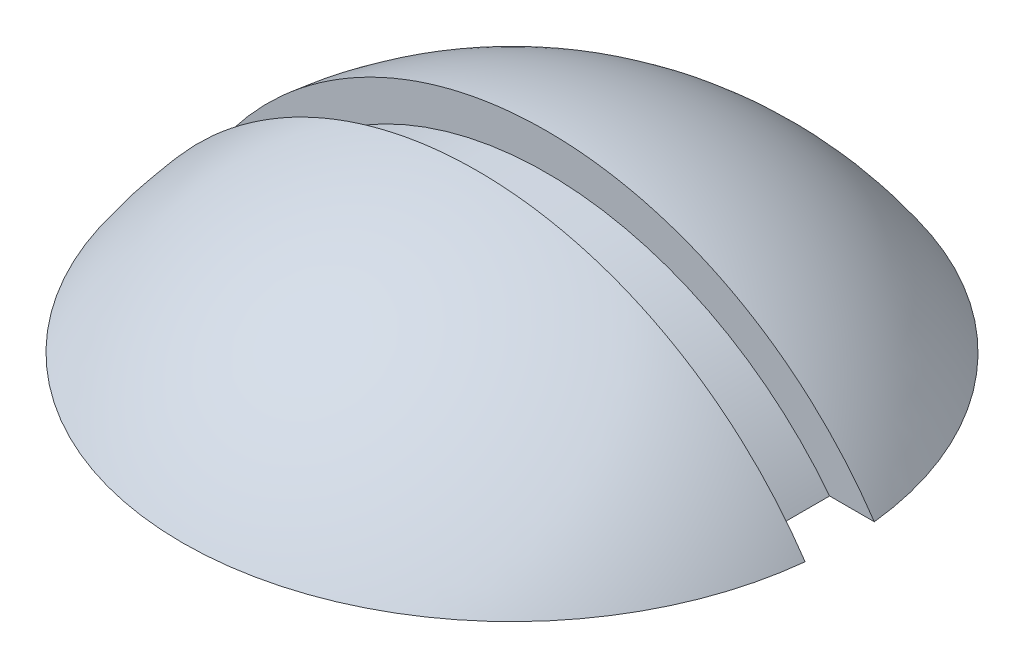
ISO-10303-21;
HEADER;
FILE_DESCRIPTION(('STEP AP214'),'2;1');
FILE_NAME('part.step','',(''),(''),'','','');
FILE_SCHEMA(('AUTOMOTIVE_DESIGN { 1 0 10303 214 1 1 1 1 }'));
ENDSEC;
DATA;
#1=APPLICATION_CONTEXT('core data for automotive mechanical design processes');
#2=APPLICATION_PROTOCOL_DEFINITION('international standard','automotive_design',2000,#1);
#3=PRODUCT_CONTEXT('',#1,'mechanical');
#4=PRODUCT('Part','Part','',(#3));
#5=PRODUCT_RELATED_PRODUCT_CATEGORY('part','',(#4));
#6=PRODUCT_DEFINITION_FORMATION('','',#4);
#7=PRODUCT_DEFINITION_CONTEXT('part definition',#1,'design');
#8=PRODUCT_DEFINITION('design','',#6,#7);
#9=PRODUCT_DEFINITION_SHAPE('','',#8);
#10=(LENGTH_UNIT() NAMED_UNIT(*) SI_UNIT(.MILLI.,.METRE.));
#11=(NAMED_UNIT(*) PLANE_ANGLE_UNIT() SI_UNIT($,.RADIAN.));
#12=(NAMED_UNIT(*) SI_UNIT($,.STERADIAN.) SOLID_ANGLE_UNIT());
#13=UNCERTAINTY_MEASURE_WITH_UNIT(LENGTH_MEASURE(1.E-05),#10,'distance_accuracy_value','');
#14=(GEOMETRIC_REPRESENTATION_CONTEXT(3) GLOBAL_UNCERTAINTY_ASSIGNED_CONTEXT((#13)) GLOBAL_UNIT_ASSIGNED_CONTEXT((#10,
#11,#12)) REPRESENTATION_CONTEXT('',''));
#15=CARTESIAN_POINT('',(0.,0.,0.));
#16=DIRECTION('',(0.,0.,1.));
#17=DIRECTION('',(1.,0.,0.));
#18=AXIS2_PLACEMENT_3D('',#15,#16,#17);
#19=CARTESIAN_POINT('',(57.1358871463461,44.4499999999999,-3.9897776749943E-13));
#20=DIRECTION('',(0.,1.,0.));
#21=DIRECTION('',(-1.,0.,0.));
#22=AXIS2_PLACEMENT_3D('',#19,#20,#21);
#23=PLANE('',#22);
#24=CARTESIAN_POINT('',(0.,44.4499999999999,0.));
#25=DIRECTION('',(0.,-1.,0.));
#26=DIRECTION('',(1.,0.,0.));
#27=AXIS2_PLACEMENT_3D('',#24,#25,#26);
#28=CIRCLE('',#27,35.56);
#29=CARTESIAN_POINT('',(35.56,44.4499999999999,0.));
#30=VERTEX_POINT('',#29);
#31=EDGE_CURVE('E127',#30,#30,#28,.T.);
#32=ORIENTED_EDGE('',*,*,#31,.F.);
#33=EDGE_LOOP('',(#32));
#34=FACE_BOUND('',#33,.T.);
#35=DIRECTION('',(0.,0.,-1.));
#36=VECTOR('',#35,1.);
#37=CARTESIAN_POINT('',(-57.1358871463462,44.45,6.9850000000004));
#38=LINE('',#37,#36);
#39=CARTESIAN_POINT('',(-57.1358871463462,44.45,6.9850000000004));
#40=VERTEX_POINT('',#39);
#41=CARTESIAN_POINT('',(-57.1358871463463,44.45,-6.9849999999996));
#42=VERTEX_POINT('',#41);
#43=EDGE_CURVE('E80',#40,#42,#38,.T.);
#44=ORIENTED_EDGE('',*,*,#43,.T.);
#45=DIRECTION('',(-1.,0.,0.));
#46=VECTOR('',#45,1.);
#47=CARTESIAN_POINT('',(-66.5266683368408,44.45,-6.98499999999954));
#48=LINE('',#47,#46);
#49=CARTESIAN_POINT('',(-66.1589553650904,44.45,-6.98499999999954));
#50=VERTEX_POINT('',#49);
#51=EDGE_CURVE('E84',#42,#50,#48,.T.);
#52=ORIENTED_EDGE('',*,*,#51,.T.);
#53=CARTESIAN_POINT('',(0.,44.4499999999999,0.));
#54=DIRECTION('',(0.,1.,0.));
#55=DIRECTION('',(1.,0.,0.));
#56=AXIS2_PLACEMENT_3D('',#53,#54,#55);
#57=CIRCLE('',#56,66.5266683368407);
#58=CARTESIAN_POINT('',(66.1589553650902,44.4499999999999,-6.98500000000046));
#59=VERTEX_POINT('',#58);
#60=EDGE_CURVE('E108',#59,#50,#57,.T.);
#61=ORIENTED_EDGE('',*,*,#60,.F.);
#62=DIRECTION('',(-1.,0.,0.));
#63=VECTOR('',#62,1.);
#64=CARTESIAN_POINT('',(66.5266683368406,44.4499999999999,-6.98500000000047));
#65=LINE('',#64,#63);
#66=CARTESIAN_POINT('',(57.1358871463462,44.4499999999999,-6.9850000000004));
#67=VERTEX_POINT('',#66);
#68=EDGE_CURVE('E99',#59,#67,#65,.T.);
#69=ORIENTED_EDGE('',*,*,#68,.T.);
#70=DIRECTION('',(0.,0.,-1.));
#71=VECTOR('',#70,1.);
#72=CARTESIAN_POINT('',(57.1358871463463,44.4499999999999,6.9849999999996));
#73=LINE('',#72,#71);
#74=CARTESIAN_POINT('',(57.1358871463463,44.4499999999999,6.9849999999996));
#75=VERTEX_POINT('',#74);
#76=EDGE_CURVE('E90',#75,#67,#73,.T.);
#77=ORIENTED_EDGE('',*,*,#76,.F.);
#78=DIRECTION('',(-1.,0.,0.));
#79=VECTOR('',#78,1.);
#80=CARTESIAN_POINT('',(66.5266683368407,44.4499999999999,6.98499999999954));
#81=LINE('',#80,#79);
#82=CARTESIAN_POINT('',(66.1589553650903,44.4499999999999,6.98499999999954));
#83=VERTEX_POINT('',#82);
#84=EDGE_CURVE('E111',#83,#75,#81,.T.);
#85=ORIENTED_EDGE('',*,*,#84,.F.);
#86=CARTESIAN_POINT('',(0.,44.4499999999999,0.));
#87=DIRECTION('',(0.,-1.,0.));
#88=DIRECTION('',(1.,0.,0.));
#89=AXIS2_PLACEMENT_3D('',#86,#87,#88);
#90=CIRCLE('',#89,66.5266683368407);
#91=CARTESIAN_POINT('',(-66.1589553650902,44.45,6.98500000000046));
#92=VERTEX_POINT('',#91);
#93=EDGE_CURVE('E50',#83,#92,#90,.T.);
#94=ORIENTED_EDGE('',*,*,#93,.T.);
#95=DIRECTION('',(-1.,0.,0.));
#96=VECTOR('',#95,1.);
#97=CARTESIAN_POINT('',(-66.5266683368406,44.45,6.98500000000047));
#98=LINE('',#97,#96);
#99=EDGE_CURVE('E57',#40,#92,#98,.T.);
#100=ORIENTED_EDGE('',*,*,#99,.F.);
#101=EDGE_LOOP('',(#44,#52,#61,#69,#77,#85,#94,#100));
#102=FACE_BOUND('',#101,.T.);
#103=ADVANCED_FACE('F41',(#34,#102),#23,.F.);
#104=CARTESIAN_POINT('',(0.,0.,0.));
#105=DIRECTION('',(0.,-1.,0.));
#106=DIRECTION('',(1.,0.,0.));
#107=AXIS2_PLACEMENT_3D('',#104,#105,#106);
#108=SPHERICAL_SURFACE('',#107,80.01);
#109=CARTESIAN_POINT('',(-1.47940054562111E-13,0.,-6.985));
#110=DIRECTION('',(0.,0.,1.));
#111=DIRECTION('',(1.,0.,0.));
#112=AXIS2_PLACEMENT_3D('',#109,#110,#111);
#113=CIRCLE('',#112,79.7045160263834);
#114=EDGE_CURVE('E11',#59,#50,#113,.T.);
#115=ORIENTED_EDGE('',*,*,#114,.F.);
#116=ORIENTED_EDGE('',*,*,#60,.T.);
#117=EDGE_LOOP('',(#115,#116));
#118=FACE_BOUND('',#117,.T.);
#119=ADVANCED_FACE('F135',(#118),#108,.T.);
#120=CARTESIAN_POINT('',(0.,0.,0.));
#121=DIRECTION('',(0.,-1.,0.));
#122=DIRECTION('',(1.,0.,0.));
#123=AXIS2_PLACEMENT_3D('',#120,#121,#122);
#124=SPHERICAL_SURFACE('',#123,80.01);
#125=CARTESIAN_POINT('',(0.,0.,6.985));
#126=DIRECTION('',(0.,0.,-1.));
#127=DIRECTION('',(-1.,0.,0.));
#128=AXIS2_PLACEMENT_3D('',#125,#126,#127);
#129=CIRCLE('',#128,79.7045160263834);
#130=EDGE_CURVE('E61',#92,#83,#129,.T.);
#131=ORIENTED_EDGE('',*,*,#130,.F.);
#132=ORIENTED_EDGE('',*,*,#93,.F.);
#133=EDGE_LOOP('',(#131,#132));
#134=FACE_BOUND('',#133,.T.);
#135=ADVANCED_FACE('F43',(#134),#124,.T.);
#136=CARTESIAN_POINT('',(0.,57.15,0.));
#137=DIRECTION('',(0.,-1.,0.));
#138=DIRECTION('',(1.,0.,0.));
#139=AXIS2_PLACEMENT_3D('',#136,#137,#138);
#140=CYLINDRICAL_SURFACE('',#139,35.56);
#141=CARTESIAN_POINT('',(0.,57.1499999999999,0.));
#142=DIRECTION('',(0.,-1.,0.));
#143=DIRECTION('',(1.,0.,0.));
#144=AXIS2_PLACEMENT_3D('',#141,#142,#143);
#145=CIRCLE('',#144,35.56);
#146=CARTESIAN_POINT('',(35.56,57.1499999999999,0.));
#147=VERTEX_POINT('',#146);
#148=EDGE_CURVE('E123',#147,#147,#145,.T.);
#149=ORIENTED_EDGE('',*,*,#148,.F.);
#150=EDGE_LOOP('',(#149));
#151=FACE_BOUND('',#150,.T.);
#152=ORIENTED_EDGE('',*,*,#31,.T.);
#153=EDGE_LOOP('',(#152));
#154=FACE_BOUND('',#153,.T.);
#155=ADVANCED_FACE('F134',(#151,#154),#140,.F.);
#156=CARTESIAN_POINT('',(0.,57.15,0.));
#157=DIRECTION('',(0.,1.,0.));
#158=DIRECTION('',(-1.,0.,0.));
#159=AXIS2_PLACEMENT_3D('',#156,#157,#158);
#160=PLANE('',#159);
#161=ORIENTED_EDGE('',*,*,#148,.T.);
#162=EDGE_LOOP('',(#161));
#163=FACE_BOUND('',#162,.T.);
#164=ADVANCED_FACE('F140',(#163),#160,.F.);
#165=CARTESIAN_POINT('',(0.,0.,6.985));
#166=DIRECTION('',(0.,0.,-1.));
#167=DIRECTION('',(-1.,0.,0.));
#168=AXIS2_PLACEMENT_3D('',#165,#166,#167);
#169=PLANE('',#168);
#170=ORIENTED_EDGE('',*,*,#130,.T.);
#171=ORIENTED_EDGE('',*,*,#84,.T.);
#172=CARTESIAN_POINT('',(0.,0.,6.985));
#173=DIRECTION('',(0.,0.,1.));
#174=DIRECTION('',(-1.,0.,0.));
#175=AXIS2_PLACEMENT_3D('',#172,#173,#174);
#176=CIRCLE('',#175,72.39);
#177=EDGE_CURVE('E114',#75,#40,#176,.T.);
#178=ORIENTED_EDGE('',*,*,#177,.T.);
#179=ORIENTED_EDGE('',*,*,#99,.T.);
#180=EDGE_LOOP('',(#170,#171,#178,#179));
#181=FACE_BOUND('',#180,.T.);
#182=ADVANCED_FACE('F153',(#181),#169,.T.);
#183=CARTESIAN_POINT('',(0.,0.,6.985));
#184=DIRECTION('',(0.,0.,-1.));
#185=DIRECTION('',(-1.,0.,0.));
#186=AXIS2_PLACEMENT_3D('',#183,#184,#185);
#187=CYLINDRICAL_SURFACE('',#186,72.39);
#188=ORIENTED_EDGE('',*,*,#76,.T.);
#189=CARTESIAN_POINT('',(-1.47940054562111E-13,0.,-6.985));
#190=DIRECTION('',(0.,0.,1.));
#191=DIRECTION('',(-1.,0.,0.));
#192=AXIS2_PLACEMENT_3D('',#189,#190,#191);
#193=CIRCLE('',#192,72.39);
#194=EDGE_CURVE('E93',#67,#42,#193,.T.);
#195=ORIENTED_EDGE('',*,*,#194,.T.);
#196=ORIENTED_EDGE('',*,*,#43,.F.);
#197=ORIENTED_EDGE('',*,*,#177,.F.);
#198=EDGE_LOOP('',(#188,#195,#196,#197));
#199=FACE_BOUND('',#198,.T.);
#200=ADVANCED_FACE('F94',(#199),#187,.T.);
#201=CARTESIAN_POINT('',(-1.47940054562111E-13,0.,-6.985));
#202=DIRECTION('',(0.,0.,1.));
#203=DIRECTION('',(-1.,0.,0.));
#204=AXIS2_PLACEMENT_3D('',#201,#202,#203);
#205=PLANE('',#204);
#206=ORIENTED_EDGE('',*,*,#114,.T.);
#207=ORIENTED_EDGE('',*,*,#51,.F.);
#208=ORIENTED_EDGE('',*,*,#194,.F.);
#209=ORIENTED_EDGE('',*,*,#68,.F.);
#210=EDGE_LOOP('',(#206,#207,#208,#209));
#211=FACE_BOUND('',#210,.T.);
#212=ADVANCED_FACE('F101',(#211),#205,.T.);
#213=CLOSED_SHELL('',(#103,#119,#135,#155,#164,#182,#200,#212));
#214=MANIFOLD_SOLID_BREP('B2',#213);
#215=ADVANCED_BREP_SHAPE_REPRESENTATION('',(#18,#214),#14);
#216=SHAPE_DEFINITION_REPRESENTATION(#9,#215);
ENDSEC;
END-ISO-10303-21;
